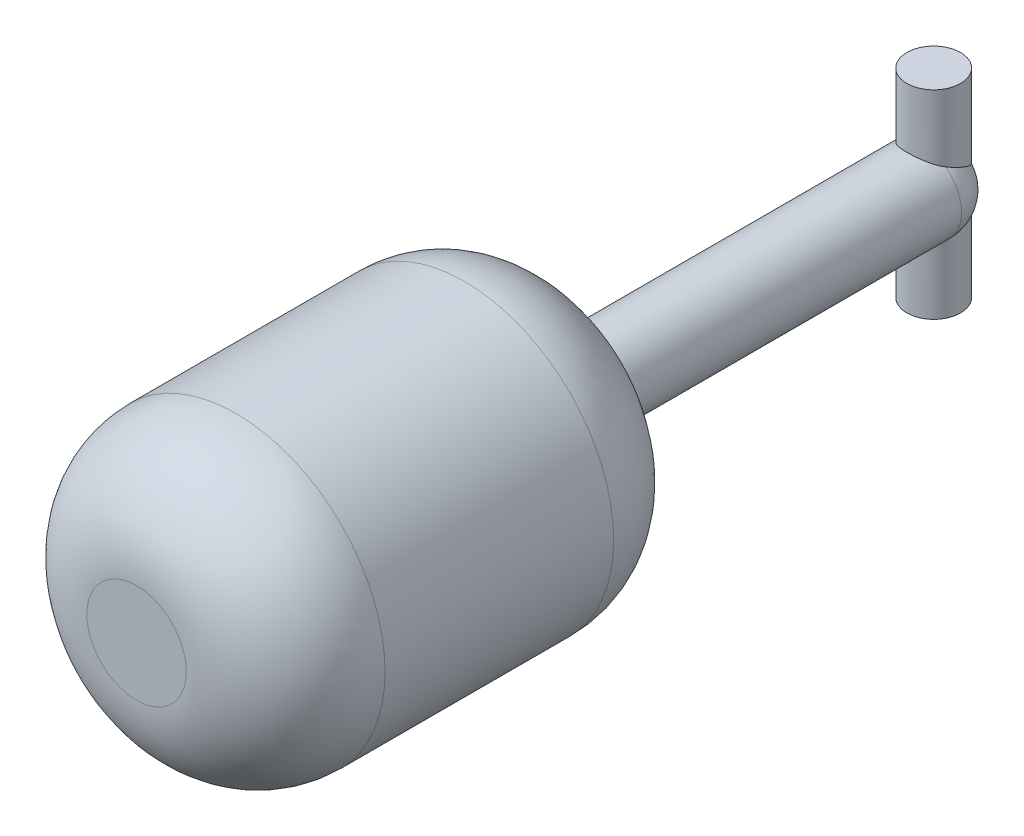
ISO-10303-21;
HEADER;
FILE_DESCRIPTION(('STEP AP214'),'2;1');
FILE_NAME('part.step','',(''),(''),'','','');
FILE_SCHEMA(('AUTOMOTIVE_DESIGN { 1 0 10303 214 1 1 1 1 }'));
ENDSEC;
DATA;
#1=APPLICATION_CONTEXT('core data for automotive mechanical design processes');
#2=APPLICATION_PROTOCOL_DEFINITION('international standard','automotive_design',2000,#1);
#3=PRODUCT_CONTEXT('',#1,'mechanical');
#4=PRODUCT('Part','Part','',(#3));
#5=PRODUCT_RELATED_PRODUCT_CATEGORY('part','',(#4));
#6=PRODUCT_DEFINITION_FORMATION('','',#4);
#7=PRODUCT_DEFINITION_CONTEXT('part definition',#1,'design');
#8=PRODUCT_DEFINITION('design','',#6,#7);
#9=PRODUCT_DEFINITION_SHAPE('','',#8);
#10=(LENGTH_UNIT() NAMED_UNIT(*) SI_UNIT(.MILLI.,.METRE.));
#11=(NAMED_UNIT(*) PLANE_ANGLE_UNIT() SI_UNIT($,.RADIAN.));
#12=(NAMED_UNIT(*) SI_UNIT($,.STERADIAN.) SOLID_ANGLE_UNIT());
#13=UNCERTAINTY_MEASURE_WITH_UNIT(LENGTH_MEASURE(1.E-05),#10,'distance_accuracy_value','');
#14=(GEOMETRIC_REPRESENTATION_CONTEXT(3) GLOBAL_UNCERTAINTY_ASSIGNED_CONTEXT((#13)) GLOBAL_UNIT_ASSIGNED_CONTEXT((#10,
#11,#12)) REPRESENTATION_CONTEXT('',''));
#15=CARTESIAN_POINT('',(0.,0.,0.));
#16=DIRECTION('',(0.,0.,1.));
#17=DIRECTION('',(1.,0.,0.));
#18=AXIS2_PLACEMENT_3D('',#15,#16,#17);
#19=CARTESIAN_POINT('',(0.,0.,83.));
#20=DIRECTION('',(0.,0.,1.));
#21=DIRECTION('',(1.,0.,0.));
#22=AXIS2_PLACEMENT_3D('',#19,#20,#21);
#23=PLANE('',#22);
#24=CARTESIAN_POINT('',(0.,0.,83.));
#25=DIRECTION('',(0.,0.,1.));
#26=DIRECTION('',(1.,0.,0.));
#27=AXIS2_PLACEMENT_3D('',#24,#25,#26);
#28=CIRCLE('',#27,5.);
#29=CARTESIAN_POINT('',(5.,0.,83.));
#30=VERTEX_POINT('',#29);
#31=EDGE_CURVE('E52',#30,#30,#28,.T.);
#32=ORIENTED_EDGE('',*,*,#31,.T.);
#33=EDGE_LOOP('',(#32));
#34=FACE_BOUND('',#33,.T.);
#35=ADVANCED_FACE('F44',(#34),#23,.T.);
#36=CARTESIAN_POINT('',(0.,0.,40.));
#37=DIRECTION('',(0.,0.,1.));
#38=DIRECTION('',(1.,0.,0.));
#39=AXIS2_PLACEMENT_3D('',#36,#37,#38);
#40=PLANE('',#39);
#41=CARTESIAN_POINT('',(0.,0.,40.));
#42=DIRECTION('',(0.,0.,1.));
#43=DIRECTION('',(1.,0.,0.));
#44=AXIS2_PLACEMENT_3D('',#41,#42,#43);
#45=CIRCLE('',#44,5.);
#46=CARTESIAN_POINT('',(5.,0.,40.));
#47=VERTEX_POINT('',#46);
#48=EDGE_CURVE('E71',#47,#47,#45,.F.);
#49=ORIENTED_EDGE('',*,*,#48,.T.);
#50=EDGE_LOOP('',(#49));
#51=FACE_BOUND('',#50,.T.);
#52=ADVANCED_FACE('F82',(#51),#40,.F.);
#53=CARTESIAN_POINT('',(0.,0.,50.));
#54=DIRECTION('',(0.,0.,1.));
#55=DIRECTION('',(1.,0.,0.));
#56=AXIS2_PLACEMENT_3D('',#53,#54,#55);
#57=DEGENERATE_TOROIDAL_SURFACE('',#56,5.,10.,.T.);
#58=ORIENTED_EDGE('',*,*,#48,.F.);
#59=EDGE_LOOP('',(#58));
#60=FACE_BOUND('',#59,.T.);
#61=CARTESIAN_POINT('',(0.,0.,50.));
#62=DIRECTION('',(0.,0.,1.));
#63=DIRECTION('',(1.,0.,0.));
#64=AXIS2_PLACEMENT_3D('',#61,#62,#63);
#65=CIRCLE('',#64,15.);
#66=CARTESIAN_POINT('',(15.,0.,50.));
#67=VERTEX_POINT('',#66);
#68=EDGE_CURVE('E74',#67,#67,#65,.T.);
#69=ORIENTED_EDGE('',*,*,#68,.F.);
#70=EDGE_LOOP('',(#69));
#71=FACE_BOUND('',#70,.T.);
#72=ADVANCED_FACE('F80',(#60,#71),#57,.T.);
#73=CARTESIAN_POINT('',(0.,0.,80.));
#74=DIRECTION('',(0.,0.,-1.));
#75=DIRECTION('',(-1.,0.,0.));
#76=AXIS2_PLACEMENT_3D('',#73,#74,#75);
#77=CYLINDRICAL_SURFACE('',#76,15.);
#78=CARTESIAN_POINT('',(0.,0.,73.));
#79=DIRECTION('',(0.,0.,1.));
#80=DIRECTION('',(1.,0.,0.));
#81=AXIS2_PLACEMENT_3D('',#78,#79,#80);
#82=CIRCLE('',#81,15.);
#83=CARTESIAN_POINT('',(15.,0.,73.));
#84=VERTEX_POINT('',#83);
#85=EDGE_CURVE('E11',#84,#84,#82,.F.);
#86=ORIENTED_EDGE('',*,*,#85,.T.);
#87=EDGE_LOOP('',(#86));
#88=FACE_BOUND('',#87,.T.);
#89=ORIENTED_EDGE('',*,*,#68,.T.);
#90=EDGE_LOOP('',(#89));
#91=FACE_BOUND('',#90,.T.);
#92=ADVANCED_FACE('F78',(#88,#91),#77,.T.);
#93=CARTESIAN_POINT('',(0.,0.,73.));
#94=DIRECTION('',(0.,0.,1.));
#95=DIRECTION('',(1.,0.,0.));
#96=AXIS2_PLACEMENT_3D('',#93,#94,#95);
#97=DEGENERATE_TOROIDAL_SURFACE('',#96,5.,10.,.T.);
#98=ORIENTED_EDGE('',*,*,#85,.F.);
#99=EDGE_LOOP('',(#98));
#100=FACE_BOUND('',#99,.T.);
#101=ORIENTED_EDGE('',*,*,#31,.F.);
#102=EDGE_LOOP('',(#101));
#103=FACE_BOUND('',#102,.T.);
#104=ADVANCED_FACE('F46',(#100,#103),#97,.T.);
#105=CLOSED_SHELL('',(#35,#52,#72,#92,#104));
#106=CARTESIAN_POINT('',(0.,0.,80.));
#107=DIRECTION('',(0.,0.,-1.));
#108=DIRECTION('',(-1.,0.,0.));
#109=AXIS2_PLACEMENT_3D('',#106,#107,#108);
#110=CYLINDRICAL_SURFACE('',#109,12.);
#111=CARTESIAN_POINT('',(0.,0.,70.));
#112=DIRECTION('',(0.,0.,1.));
#113=DIRECTION('',(1.,0.,0.));
#114=AXIS2_PLACEMENT_3D('',#111,#112,#113);
#115=CIRCLE('',#114,12.);
#116=CARTESIAN_POINT('',(12.,0.,70.));
#117=VERTEX_POINT('',#116);
#118=EDGE_CURVE('E60',#117,#117,#115,.T.);
#119=ORIENTED_EDGE('',*,*,#118,.T.);
#120=EDGE_LOOP('',(#119));
#121=FACE_BOUND('',#120,.T.);
#122=CARTESIAN_POINT('',(0.,0.,53.));
#123=DIRECTION('',(0.,0.,1.));
#124=DIRECTION('',(1.,0.,0.));
#125=AXIS2_PLACEMENT_3D('',#122,#123,#124);
#126=CIRCLE('',#125,12.);
#127=CARTESIAN_POINT('',(12.,0.,53.));
#128=VERTEX_POINT('',#127);
#129=EDGE_CURVE('E65',#128,#128,#126,.F.);
#130=ORIENTED_EDGE('',*,*,#129,.T.);
#131=EDGE_LOOP('',(#130));
#132=FACE_BOUND('',#131,.T.);
#133=ADVANCED_FACE('F109',(#121,#132),#110,.F.);
#134=CARTESIAN_POINT('',(0.,0.,43.));
#135=DIRECTION('',(0.,0.,1.));
#136=DIRECTION('',(1.,0.,0.));
#137=AXIS2_PLACEMENT_3D('',#134,#135,#136);
#138=PLANE('',#137);
#139=CARTESIAN_POINT('',(0.,0.,43.));
#140=DIRECTION('',(0.,0.,1.));
#141=DIRECTION('',(1.,0.,0.));
#142=AXIS2_PLACEMENT_3D('',#139,#140,#141);
#143=CIRCLE('',#142,2.);
#144=CARTESIAN_POINT('',(2.,0.,43.));
#145=VERTEX_POINT('',#144);
#146=EDGE_CURVE('E68',#145,#145,#143,.T.);
#147=ORIENTED_EDGE('',*,*,#146,.T.);
#148=EDGE_LOOP('',(#147));
#149=FACE_BOUND('',#148,.T.);
#150=ADVANCED_FACE('F107',(#149),#138,.T.);
#151=CARTESIAN_POINT('',(0.,0.,53.));
#152=DIRECTION('',(0.,0.,1.));
#153=DIRECTION('',(1.,0.,0.));
#154=AXIS2_PLACEMENT_3D('',#151,#152,#153);
#155=DEGENERATE_TOROIDAL_SURFACE('',#154,2.,10.,.T.);
#156=ORIENTED_EDGE('',*,*,#129,.F.);
#157=EDGE_LOOP('',(#156));
#158=FACE_BOUND('',#157,.T.);
#159=ORIENTED_EDGE('',*,*,#146,.F.);
#160=EDGE_LOOP('',(#159));
#161=FACE_BOUND('',#160,.T.);
#162=ADVANCED_FACE('F104',(#158,#161),#155,.F.);
#163=CARTESIAN_POINT('',(0.,0.,80.));
#164=DIRECTION('',(0.,0.,1.));
#165=DIRECTION('',(1.,0.,0.));
#166=AXIS2_PLACEMENT_3D('',#163,#164,#165);
#167=PLANE('',#166);
#168=CARTESIAN_POINT('',(0.,0.,80.));
#169=DIRECTION('',(0.,0.,1.));
#170=DIRECTION('',(1.,0.,0.));
#171=AXIS2_PLACEMENT_3D('',#168,#169,#170);
#172=CIRCLE('',#171,2.);
#173=CARTESIAN_POINT('',(2.,0.,80.));
#174=VERTEX_POINT('',#173);
#175=EDGE_CURVE('E56',#174,#174,#172,.F.);
#176=ORIENTED_EDGE('',*,*,#175,.T.);
#177=EDGE_LOOP('',(#176));
#178=FACE_BOUND('',#177,.T.);
#179=ADVANCED_FACE('F100',(#178),#167,.F.);
#180=CARTESIAN_POINT('',(0.,0.,70.));
#181=DIRECTION('',(0.,0.,1.));
#182=DIRECTION('',(1.,0.,0.));
#183=AXIS2_PLACEMENT_3D('',#180,#181,#182);
#184=DEGENERATE_TOROIDAL_SURFACE('',#183,2.,10.,.T.);
#185=ORIENTED_EDGE('',*,*,#175,.F.);
#186=EDGE_LOOP('',(#185));
#187=FACE_BOUND('',#186,.T.);
#188=ORIENTED_EDGE('',*,*,#118,.F.);
#189=EDGE_LOOP('',(#188));
#190=FACE_BOUND('',#189,.T.);
#191=ADVANCED_FACE('F103',(#187,#190),#184,.F.);
#192=CLOSED_SHELL('',(#133,#150,#162,#179,#191));
#193=ORIENTED_CLOSED_SHELL('',*,#192,.T.);
#194=BREP_WITH_VOIDS('B2',#105,(#193));
#195=CARTESIAN_POINT('',(0.,0.,40.));
#196=DIRECTION('',(0.,0.,-1.));
#197=DIRECTION('',(-1.,0.,0.));
#198=AXIS2_PLACEMENT_3D('',#195,#196,#197);
#199=CYLINDRICAL_SURFACE('',#198,4.);
#200=CARTESIAN_POINT('',(0.,-4.,5.5));
#201=CARTESIAN_POINT('',(0.13525164207156,-3.999993518137,5.49999290005186));
#202=CARTESIAN_POINT('',(0.270554028356534,-3.99307643232038,5.48977494154777));
#203=CARTESIAN_POINT('',(0.536851478418564,-3.9660753080996,5.44952242900665));
#204=CARTESIAN_POINT('',(0.667843000968334,-3.94598071504067,5.41947198982437));
#205=CARTESIAN_POINT('',(0.921237374068988,-3.89460751600821,5.34142171688508));
#206=CARTESIAN_POINT('',(1.04367877575305,-3.86338358991236,5.29350958802995));
#207=CARTESIAN_POINT('',(1.27825765475173,-3.79224252538454,5.18179668099204));
#208=CARTESIAN_POINT('',(1.39039412858649,-3.7523245416099,5.11799435768348));
#209=CARTESIAN_POINT('',(1.61205697896816,-3.66288843726566,4.970369372914));
#210=CARTESIAN_POINT('',(1.72053382128457,-3.61284047677658,4.88529862315981));
#211=CARTESIAN_POINT('',(1.92266533294142,-3.50945550197188,4.70056389289389));
#212=CARTESIAN_POINT('',(2.01629804570517,-3.45611377468099,4.60087870709038));
#213=CARTESIAN_POINT('',(2.2016374731949,-3.34162684993736,4.37099321756632));
#214=CARTESIAN_POINT('',(2.29056486800151,-3.28062033453726,4.23846616507814));
#215=CARTESIAN_POINT('',(2.44481502496016,-3.16733881888995,3.95694855652788));
#216=CARTESIAN_POINT('',(2.51017851323489,-3.11504883856034,3.80798699247689));
#217=CARTESIAN_POINT('',(2.5986388236772,-3.04127798290587,3.54196654773204));
#218=CARTESIAN_POINT('',(2.62851431747639,-3.01525894892984,3.42843373052885));
#219=CARTESIAN_POINT('',(2.67333867634867,-2.97559697930801,3.19643455089498));
#220=CARTESIAN_POINT('',(2.68831385195963,-2.96193223274288,3.07797727076724));
#221=CARTESIAN_POINT('',(2.70238874552766,-2.94910199602149,2.83876503424567));
#222=CARTESIAN_POINT('',(2.70141713183757,-2.95000165371578,2.71800216877523));
#223=CARTESIAN_POINT('',(2.68349689692319,-2.96630639076805,2.47863579362976));
#224=CARTESIAN_POINT('',(2.66653663287508,-2.98172204056105,2.36003392173356));
#225=CARTESIAN_POINT('',(2.6190035634682,-3.02353152860114,2.13402935766074));
#226=CARTESIAN_POINT('',(2.58914308881994,-3.04934666584866,2.02636280693319));
#227=CARTESIAN_POINT('',(2.5173142214509,-3.10890744847768,1.81747838350058));
#228=CARTESIAN_POINT('',(2.47533650857834,-3.14265919469987,1.71626554820684));
#229=CARTESIAN_POINT('',(2.35761593635998,-3.23255557456621,1.47431907083862));
#230=CARTESIAN_POINT('',(2.27532898573239,-3.29168544424409,1.3378595463383));
#231=CARTESIAN_POINT('',(2.08897003320918,-3.4130065102,1.08206274665898));
#232=CARTESIAN_POINT('',(1.98485850538836,-3.47520310205832,0.962757208751298));
#233=CARTESIAN_POINT('',(1.755422941596,-3.59659270451757,0.742336374084662));
#234=CARTESIAN_POINT('',(1.62993584933008,-3.65575770192453,0.641374254723838));
#235=CARTESIAN_POINT('',(1.36018379757103,-3.76442995528449,0.462050947950952));
#236=CARTESIAN_POINT('',(1.21595837203485,-3.81395701073601,0.383643264308921));
#237=CARTESIAN_POINT('',(0.945613760177467,-3.88856250325703,0.267726689034686));
#238=CARTESIAN_POINT('',(0.822549258937164,-3.91662580532116,0.225007032745261));
#239=CARTESIAN_POINT('',(0.569590487871059,-3.96131472415193,0.157527397342875));
#240=CARTESIAN_POINT('',(0.439700861576448,-3.97794801168562,0.132755372834098));
#241=CARTESIAN_POINT('',(0.176241405854664,-3.99830519761612,0.102487850774166));
#242=CARTESIAN_POINT('',(0.0426611239974739,-4.00198758891438,0.0970543316853545));
#243=CARTESIAN_POINT('',(-0.223536078802516,-3.99596741539106,0.105975754487917));
#244=CARTESIAN_POINT('',(-0.356152931631484,-3.98626391327706,0.120332082082308));
#245=CARTESIAN_POINT('',(-0.609770387964585,-3.95521155503772,0.166755901176293));
#246=CARTESIAN_POINT('',(-0.731019794201065,-3.9344727327074,0.19789662061766));
#247=CARTESIAN_POINT('',(-0.966225980547811,-3.88341424434936,0.275763868066081));
#248=CARTESIAN_POINT('',(-1.08018142454689,-3.85309282898366,0.32249324192658));
#249=CARTESIAN_POINT('',(-1.30794946620335,-3.7821492272186,0.434270876578236));
#250=CARTESIAN_POINT('',(-1.42096995748598,-3.74088228847242,0.500515025583156));
#251=CARTESIAN_POINT('',(-1.63481662527914,-3.65250451318952,0.647275590459889));
#252=CARTESIAN_POINT('',(-1.73563298865063,-3.60538903478359,0.727803364983003));
#253=CARTESIAN_POINT('',(-1.93982421981794,-3.50033540739044,0.916002443897186));
#254=CARTESIAN_POINT('',(-2.0408387055737,-3.44190010190649,1.02596063913661));
#255=CARTESIAN_POINT('',(-2.22383735602996,-3.32659589692022,1.26155719577649));
#256=CARTESIAN_POINT('',(-2.30581499668977,-3.26972754028787,1.38720091008296));
#257=CARTESIAN_POINT('',(-2.43828787268088,-3.17182959670112,1.63326598576168));
#258=CARTESIAN_POINT('',(-2.49164892498811,-3.12970180559621,1.75169899393767));
#259=CARTESIAN_POINT('',(-2.5814132242981,-3.0560916236245,1.99788464976802));
#260=CARTESIAN_POINT('',(-2.61784967930158,-3.02458841967376,2.12561847330661));
#261=CARTESIAN_POINT('',(-2.66752870963451,-2.98080925657186,2.36748916813316));
#262=CARTESIAN_POINT('',(-2.68349685770396,-2.96630524240168,2.4806518023036));
#263=CARTESIAN_POINT('',(-2.70088750358726,-2.9504848522829,2.70897630649806));
#264=CARTESIAN_POINT('',(-2.70232146140912,-2.94915808627297,2.82413652966416));
#265=CARTESIAN_POINT('',(-2.69056589995094,-2.95988294671172,3.05293007016665));
#266=CARTESIAN_POINT('',(-2.67739041434289,-2.97192173436909,3.1665647468844));
#267=CARTESIAN_POINT('',(-2.6372906054618,-3.00755697238461,3.38955541031351));
#268=CARTESIAN_POINT('',(-2.61034731289303,-3.03116936703232,3.49890526899653));
#269=CARTESIAN_POINT('',(-2.53309831794016,-3.09624097293121,3.74617838300419));
#270=CARTESIAN_POINT('',(-2.47803114343028,-3.14101248946805,3.88173007004604));
#271=CARTESIAN_POINT('',(-2.34852878478864,-3.23898118039819,4.13990562652224));
#272=CARTESIAN_POINT('',(-2.27406462296232,-3.29219091395031,4.26250976480838));
#273=CARTESIAN_POINT('',(-2.10591179352206,-3.40227029378641,4.49594141985187));
#274=CARTESIAN_POINT('',(-2.01188235686719,-3.45919050700335,4.60649852561071));
#275=CARTESIAN_POINT('',(-1.80654699356942,-3.57071683838806,4.81182535802022));
#276=CARTESIAN_POINT('',(-1.69523660906829,-3.62532235480782,4.90659099792986));
#277=CARTESIAN_POINT('',(-1.5096483541119,-3.70488819543881,5.04001039631132));
#278=CARTESIAN_POINT('',(-1.44082200773415,-3.73226129612847,5.08491845787222));
#279=CARTESIAN_POINT('',(-1.29855562801917,-3.78410818508872,5.16866190293594));
#280=CARTESIAN_POINT('',(-1.22511798891828,-3.80858345920418,5.20750040187114));
#281=CARTESIAN_POINT('',(-1.07415945769402,-3.85387849802484,5.27853308650619));
#282=CARTESIAN_POINT('',(-0.996645205253495,-3.87470398132586,5.31073768053859));
#283=CARTESIAN_POINT('',(-0.838076916347868,-3.91206651309577,5.36802149212262));
#284=CARTESIAN_POINT('',(-0.757024673840152,-3.92860570610492,5.39310427350142));
#285=CARTESIAN_POINT('',(-0.565494865818998,-3.96136585143772,5.44251238741761));
#286=CARTESIAN_POINT('',(-0.45394534906109,-3.97576987460958,5.46399374577891));
#287=CARTESIAN_POINT('',(-0.228275312759472,-3.99508798122612,5.49273799664422));
#288=CARTESIAN_POINT('',(-0.114155730903964,-4.00000547085267,5.50000599253183));
#289=CARTESIAN_POINT('',(0.,-4.,5.5));
#290=B_SPLINE_CURVE_WITH_KNOTS('',3,(#200,#201,#202,#203,#204,#205,#206,#207,#208,#209,#210,
#211,#212,#213,#214,#215,#216,#217,#218,#219,#220,#221,#222,#223,#224,#225,#226,#227,#228,#229,
#230,#231,#232,#233,#234,#235,#236,#237,#238,#239,#240,#241,#242,#243,#244,#245,#246,#247,#248,
#249,#250,#251,#252,#253,#254,#255,#256,#257,#258,#259,#260,#261,#262,#263,#264,#265,#266,#267,
#268,#269,#270,#271,#272,#273,#274,#275,#276,#277,#278,#279,#280,#281,#282,#283,#284,#285,#286,
#287,#288,#289),.UNSPECIFIED.,.T.,.F.,(4,2,2,2,2,2,2,2,2,2,2,2,2,2,2,2,2,2,2,2,2,2,2,2,2,2,2,2,
2,2,2,2,2,2,2,2,2,2,2,2,2,2,2,2,4),(0.,0.405302928326555,0.810930885199098,1.21459280341186,
1.61829398811156,2.05663420368272,2.49561685627629,3.00585079402765,3.51519860469972,
3.87452588033693,4.23321753456295,4.59351408943453,4.95407321257599,5.2968565192074,
5.63990418842015,6.14716538760557,6.65535333658142,7.16760729266616,7.67879753658696,
8.07687988795747,8.47469482173064,8.87378358021571,9.27290028467719,9.65195021770373,
10.0310693877148,10.4415600468648,10.8523786127248,11.3314859942209,11.8107573271643,
12.2189593065689,12.626356927887,12.9704053510091,13.3141824755843,13.6576296574618,
14.0015513222027,14.4581145208588,14.9153637431591,15.3813672616271,15.8474911924722,
16.107028588755,16.3664323269852,16.6254259179722,16.8842896766038,17.2264982663144,
17.5685839616301),.UNSPECIFIED.);
#291=CARTESIAN_POINT('',(-2.41867732448957,-3.18590646441479,4.));
#292=VERTEX_POINT('',#291);
#293=CARTESIAN_POINT('',(2.41867732448957,-3.18590646441479,4.));
#294=VERTEX_POINT('',#293);
#295=EDGE_CURVE('E226',#292,#294,#290,.T.);
#296=ORIENTED_EDGE('',*,*,#295,.T.);
#297=CARTESIAN_POINT('',(0.,0.,4.));
#298=DIRECTION('',(0.,0.,-1.));
#299=DIRECTION('',(-1.,0.,0.));
#300=AXIS2_PLACEMENT_3D('',#297,#298,#299);
#301=CIRCLE('',#300,4.);
#302=CARTESIAN_POINT('',(2.41867732448957,3.18590646441479,4.));
#303=VERTEX_POINT('',#302);
#304=EDGE_CURVE('E229',#294,#303,#301,.F.);
#305=ORIENTED_EDGE('',*,*,#304,.T.);
#306=CARTESIAN_POINT('',(0.,4.,5.5));
#307=CARTESIAN_POINT('',(-0.13525164207156,3.999993518137,5.49999290005186));
#308=CARTESIAN_POINT('',(-0.270554028356534,3.99307643232038,5.48977494154777));
#309=CARTESIAN_POINT('',(-0.536851478418564,3.9660753080996,5.44952242900665));
#310=CARTESIAN_POINT('',(-0.667843000968334,3.94598071504067,5.41947198982437));
#311=CARTESIAN_POINT('',(-0.921237374068988,3.89460751600821,5.34142171688508));
#312=CARTESIAN_POINT('',(-1.04367877575305,3.86338358991236,5.29350958802995));
#313=CARTESIAN_POINT('',(-1.27825765475173,3.79224252538454,5.18179668099204));
#314=CARTESIAN_POINT('',(-1.39039412858649,3.7523245416099,5.11799435768348));
#315=CARTESIAN_POINT('',(-1.61205697896816,3.66288843726566,4.970369372914));
#316=CARTESIAN_POINT('',(-1.72053382128457,3.61284047677658,4.88529862315981));
#317=CARTESIAN_POINT('',(-1.92266533294142,3.50945550197188,4.70056389289389));
#318=CARTESIAN_POINT('',(-2.01629804570517,3.45611377468099,4.60087870709038));
#319=CARTESIAN_POINT('',(-2.2016374731949,3.34162684993736,4.37099321756632));
#320=CARTESIAN_POINT('',(-2.29056486800151,3.28062033453726,4.23846616507814));
#321=CARTESIAN_POINT('',(-2.44481502496016,3.16733881888995,3.95694855652788));
#322=CARTESIAN_POINT('',(-2.51017851323489,3.11504883856034,3.80798699247689));
#323=CARTESIAN_POINT('',(-2.5986388236772,3.04127798290587,3.54196654773204));
#324=CARTESIAN_POINT('',(-2.62851431747639,3.01525894892984,3.42843373052885));
#325=CARTESIAN_POINT('',(-2.67333867634867,2.97559697930801,3.19643455089498));
#326=CARTESIAN_POINT('',(-2.68831385195963,2.96193223274288,3.07797727076724));
#327=CARTESIAN_POINT('',(-2.70238874552766,2.94910199602149,2.83876503424567));
#328=CARTESIAN_POINT('',(-2.70141713183757,2.95000165371578,2.71800216877523));
#329=CARTESIAN_POINT('',(-2.68349689692319,2.96630639076805,2.47863579362976));
#330=CARTESIAN_POINT('',(-2.66653663287508,2.98172204056105,2.36003392173356));
#331=CARTESIAN_POINT('',(-2.6190035634682,3.02353152860114,2.13402935766074));
#332=CARTESIAN_POINT('',(-2.58914308881994,3.04934666584866,2.02636280693319));
#333=CARTESIAN_POINT('',(-2.5173142214509,3.10890744847768,1.81747838350058));
#334=CARTESIAN_POINT('',(-2.47533650857834,3.14265919469987,1.71626554820684));
#335=CARTESIAN_POINT('',(-2.35761593635998,3.23255557456621,1.47431907083862));
#336=CARTESIAN_POINT('',(-2.27532898573239,3.29168544424409,1.3378595463383));
#337=CARTESIAN_POINT('',(-2.08897003320918,3.4130065102,1.08206274665898));
#338=CARTESIAN_POINT('',(-1.98485850538836,3.47520310205832,0.962757208751298));
#339=CARTESIAN_POINT('',(-1.755422941596,3.59659270451757,0.742336374084662));
#340=CARTESIAN_POINT('',(-1.62993584933008,3.65575770192453,0.641374254723838));
#341=CARTESIAN_POINT('',(-1.36018379757103,3.76442995528449,0.462050947950952));
#342=CARTESIAN_POINT('',(-1.21595837203485,3.81395701073601,0.383643264308921));
#343=CARTESIAN_POINT('',(-0.945613760177467,3.88856250325703,0.267726689034686));
#344=CARTESIAN_POINT('',(-0.822549258937164,3.91662580532116,0.225007032745261));
#345=CARTESIAN_POINT('',(-0.569590487871059,3.96131472415193,0.157527397342875));
#346=CARTESIAN_POINT('',(-0.439700861576448,3.97794801168562,0.132755372834098));
#347=CARTESIAN_POINT('',(-0.176241405854664,3.99830519761612,0.102487850774166));
#348=CARTESIAN_POINT('',(-0.0426611239974739,4.00198758891438,0.0970543316853545));
#349=CARTESIAN_POINT('',(0.223536078802516,3.99596741539106,0.105975754487917));
#350=CARTESIAN_POINT('',(0.356152931631484,3.98626391327706,0.120332082082308));
#351=CARTESIAN_POINT('',(0.609770387964585,3.95521155503772,0.166755901176293));
#352=CARTESIAN_POINT('',(0.731019794201065,3.9344727327074,0.19789662061766));
#353=CARTESIAN_POINT('',(0.966225980547811,3.88341424434936,0.275763868066081));
#354=CARTESIAN_POINT('',(1.08018142454689,3.85309282898366,0.32249324192658));
#355=CARTESIAN_POINT('',(1.30794946620335,3.7821492272186,0.434270876578236));
#356=CARTESIAN_POINT('',(1.42096995748598,3.74088228847242,0.500515025583156));
#357=CARTESIAN_POINT('',(1.63481662527914,3.65250451318952,0.647275590459889));
#358=CARTESIAN_POINT('',(1.73563298865063,3.60538903478359,0.727803364983003));
#359=CARTESIAN_POINT('',(1.93982421981794,3.50033540739044,0.916002443897186));
#360=CARTESIAN_POINT('',(2.0408387055737,3.44190010190649,1.02596063913661));
#361=CARTESIAN_POINT('',(2.22383735602996,3.32659589692022,1.26155719577649));
#362=CARTESIAN_POINT('',(2.30581499668977,3.26972754028787,1.38720091008296));
#363=CARTESIAN_POINT('',(2.43828787268088,3.17182959670112,1.63326598576168));
#364=CARTESIAN_POINT('',(2.49164892498811,3.12970180559621,1.75169899393767));
#365=CARTESIAN_POINT('',(2.5814132242981,3.0560916236245,1.99788464976802));
#366=CARTESIAN_POINT('',(2.61784967930158,3.02458841967376,2.12561847330661));
#367=CARTESIAN_POINT('',(2.66752870963451,2.98080925657186,2.36748916813316));
#368=CARTESIAN_POINT('',(2.68349685770396,2.96630524240168,2.4806518023036));
#369=CARTESIAN_POINT('',(2.70088750358726,2.9504848522829,2.70897630649806));
#370=CARTESIAN_POINT('',(2.70232146140912,2.94915808627297,2.82413652966416));
#371=CARTESIAN_POINT('',(2.69056589995094,2.95988294671172,3.05293007016665));
#372=CARTESIAN_POINT('',(2.67739041434289,2.97192173436909,3.1665647468844));
#373=CARTESIAN_POINT('',(2.6372906054618,3.00755697238461,3.38955541031351));
#374=CARTESIAN_POINT('',(2.61034731289303,3.03116936703232,3.49890526899653));
#375=CARTESIAN_POINT('',(2.53309831794016,3.09624097293121,3.74617838300419));
#376=CARTESIAN_POINT('',(2.47803114343028,3.14101248946805,3.88173007004604));
#377=CARTESIAN_POINT('',(2.34852878478864,3.23898118039819,4.13990562652224));
#378=CARTESIAN_POINT('',(2.27406462296232,3.29219091395031,4.26250976480838));
#379=CARTESIAN_POINT('',(2.10591179352206,3.40227029378641,4.49594141985187));
#380=CARTESIAN_POINT('',(2.01188235686719,3.45919050700335,4.60649852561071));
#381=CARTESIAN_POINT('',(1.80654699356942,3.57071683838806,4.81182535802022));
#382=CARTESIAN_POINT('',(1.69523660906829,3.62532235480782,4.90659099792986));
#383=CARTESIAN_POINT('',(1.5096483541119,3.70488819543881,5.04001039631132));
#384=CARTESIAN_POINT('',(1.44082200773415,3.73226129612847,5.08491845787222));
#385=CARTESIAN_POINT('',(1.29855562801917,3.78410818508872,5.16866190293594));
#386=CARTESIAN_POINT('',(1.22511798891828,3.80858345920418,5.20750040187114));
#387=CARTESIAN_POINT('',(1.07415945769402,3.85387849802484,5.27853308650619));
#388=CARTESIAN_POINT('',(0.996645205253495,3.87470398132586,5.31073768053859));
#389=CARTESIAN_POINT('',(0.838076916347868,3.91206651309577,5.36802149212262));
#390=CARTESIAN_POINT('',(0.757024673840152,3.92860570610492,5.39310427350142));
#391=CARTESIAN_POINT('',(0.565494865818998,3.96136585143772,5.44251238741761));
#392=CARTESIAN_POINT('',(0.45394534906109,3.97576987460958,5.46399374577891));
#393=CARTESIAN_POINT('',(0.228275312759472,3.99508798122612,5.49273799664422));
#394=CARTESIAN_POINT('',(0.114155730903964,4.00000547085267,5.50000599253183));
#395=CARTESIAN_POINT('',(0.,4.,5.5));
#396=B_SPLINE_CURVE_WITH_KNOTS('',3,(#306,#307,#308,#309,#310,#311,#312,#313,#314,#315,#316,
#317,#318,#319,#320,#321,#322,#323,#324,#325,#326,#327,#328,#329,#330,#331,#332,#333,#334,#335,
#336,#337,#338,#339,#340,#341,#342,#343,#344,#345,#346,#347,#348,#349,#350,#351,#352,#353,#354,
#355,#356,#357,#358,#359,#360,#361,#362,#363,#364,#365,#366,#367,#368,#369,#370,#371,#372,#373,
#374,#375,#376,#377,#378,#379,#380,#381,#382,#383,#384,#385,#386,#387,#388,#389,#390,#391,#392,
#393,#394,#395),.UNSPECIFIED.,.T.,.F.,(4,2,2,2,2,2,2,2,2,2,2,2,2,2,2,2,2,2,2,2,2,2,2,2,2,2,2,2,
2,2,2,2,2,2,2,2,2,2,2,2,2,2,2,2,4),(0.,0.405302928326555,0.810930885199098,1.21459280341186,
1.61829398811156,2.05663420368272,2.49561685627629,3.00585079402765,3.51519860469972,
3.87452588033693,4.23321753456295,4.59351408943453,4.95407321257599,5.2968565192074,
5.63990418842015,6.14716538760557,6.65535333658142,7.16760729266616,7.67879753658696,
8.07687988795747,8.47469482173064,8.87378358021571,9.27290028467719,9.65195021770373,
10.0310693877148,10.4415600468648,10.8523786127248,11.3314859942209,11.8107573271643,
12.2189593065689,12.626356927887,12.9704053510091,13.3141824755843,13.6576296574618,
14.0015513222027,14.4581145208588,14.9153637431591,15.3813672616271,15.8474911924722,
16.107028588755,16.3664323269852,16.6254259179722,16.8842896766038,17.2264982663144,
17.5685839616301),.UNSPECIFIED.);
#397=CARTESIAN_POINT('',(-2.41867732448957,3.18590646441479,4.));
#398=VERTEX_POINT('',#397);
#399=EDGE_CURVE('E232',#303,#398,#396,.T.);
#400=ORIENTED_EDGE('',*,*,#399,.T.);
#401=CARTESIAN_POINT('',(0.,0.,4.));
#402=DIRECTION('',(0.,0.,-1.));
#403=DIRECTION('',(-1.,0.,0.));
#404=AXIS2_PLACEMENT_3D('',#401,#402,#403);
#405=CIRCLE('',#404,4.);
#406=EDGE_CURVE('E230',#398,#292,#405,.F.);
#407=ORIENTED_EDGE('',*,*,#406,.T.);
#408=EDGE_LOOP('',(#296,#305,#400,#407));
#409=FACE_BOUND('',#408,.T.);
#410=CARTESIAN_POINT('',(0.,0.,40.));
#411=DIRECTION('',(0.,0.,1.));
#412=DIRECTION('',(1.,0.,0.));
#413=AXIS2_PLACEMENT_3D('',#410,#411,#412);
#414=CIRCLE('',#413,4.);
#415=CARTESIAN_POINT('',(4.,0.,40.));
#416=VERTEX_POINT('',#415);
#417=EDGE_CURVE('E231',#416,#416,#414,.T.);
#418=ORIENTED_EDGE('',*,*,#417,.F.);
#419=EDGE_LOOP('',(#418));
#420=FACE_BOUND('',#419,.T.);
#421=ADVANCED_FACE('F192',(#409,#420),#199,.T.);
#422=CARTESIAN_POINT('',(0.,0.,40.));
#423=DIRECTION('',(0.,0.,1.));
#424=DIRECTION('',(1.,0.,0.));
#425=AXIS2_PLACEMENT_3D('',#422,#423,#424);
#426=PLANE('',#425);
#427=ORIENTED_EDGE('',*,*,#417,.T.);
#428=EDGE_LOOP('',(#427));
#429=FACE_BOUND('',#428,.T.);
#430=ADVANCED_FACE('F247',(#429),#426,.T.);
#431=CARTESIAN_POINT('',(0.,10.,2.8));
#432=DIRECTION('',(0.,1.,0.));
#433=DIRECTION('',(0.,0.,1.));
#434=AXIS2_PLACEMENT_3D('',#431,#432,#433);
#435=PLANE('',#434);
#436=CARTESIAN_POINT('',(0.,10.,2.8));
#437=DIRECTION('',(0.,1.,0.));
#438=DIRECTION('',(0.,0.,1.));
#439=AXIS2_PLACEMENT_3D('',#436,#437,#438);
#440=CIRCLE('',#439,2.7);
#441=CARTESIAN_POINT('',(0.,10.,5.5));
#442=VERTEX_POINT('',#441);
#443=EDGE_CURVE('E275',#442,#442,#440,.T.);
#444=ORIENTED_EDGE('',*,*,#443,.T.);
#445=EDGE_LOOP('',(#444));
#446=FACE_BOUND('',#445,.T.);
#447=ADVANCED_FACE('F263',(#446),#435,.T.);
#448=CARTESIAN_POINT('',(0.,-10.,2.8));
#449=DIRECTION('',(0.,1.,0.));
#450=DIRECTION('',(0.,0.,1.));
#451=AXIS2_PLACEMENT_3D('',#448,#449,#450);
#452=CYLINDRICAL_SURFACE('',#451,2.7);
#453=ORIENTED_EDGE('',*,*,#443,.F.);
#454=EDGE_LOOP('',(#453));
#455=FACE_BOUND('',#454,.T.);
#456=ORIENTED_EDGE('',*,*,#399,.F.);
#457=CARTESIAN_POINT('',(2.41867732448957,3.18590646441479,4.));
#458=CARTESIAN_POINT('',(2.45492909212996,3.15839294052424,3.92695156175378));
#459=CARTESIAN_POINT('',(2.48771758414108,3.13000536775839,3.85253309888428));
#460=CARTESIAN_POINT('',(2.5462875463546,3.07160980134171,3.7016399633198));
#461=CARTESIAN_POINT('',(2.57207178506884,3.04160245356395,3.62516611621246));
#462=CARTESIAN_POINT('',(2.61651394704204,2.98016653939499,3.47102175748681));
#463=CARTESIAN_POINT('',(2.63519328844404,2.94874256908289,3.39335558866503));
#464=CARTESIAN_POINT('',(2.66554795634037,2.88451498860138,3.23724727235668));
#465=CARTESIAN_POINT('',(2.67722272116352,2.85171126802051,3.15880506315479));
#466=CARTESIAN_POINT('',(2.70177380998873,2.75148238785563,2.92342003797798));
#467=CARTESIAN_POINT('',(2.70426727363915,2.6821133879833,2.76609970409627));
#468=CARTESIAN_POINT('',(2.68244284826093,2.53924826569995,2.45527894351561));
#469=CARTESIAN_POINT('',(2.65810837399867,2.46574961698045,2.30178093982924));
#470=CARTESIAN_POINT('',(2.58216098097444,2.31151274042805,1.99451491081082));
#471=CARTESIAN_POINT('',(2.52914377106274,2.2305979607114,1.84118137087347));
#472=CARTESIAN_POINT('',(2.39726440990542,2.0664998267294,1.54737058527256));
#473=CARTESIAN_POINT('',(2.31839376328675,1.98331573502218,1.40689758498602));
#474=CARTESIAN_POINT('',(2.13261632615452,1.81191866756235,1.13555791019331));
#475=CARTESIAN_POINT('',(2.02447252286077,1.72366774581649,1.00556135860578));
#476=CARTESIAN_POINT('',(1.78511587142592,1.54890090973742,0.76729397698571));
#477=CARTESIAN_POINT('',(1.6539000086965,1.4623852237773,0.659025989964243));
#478=CARTESIAN_POINT('',(1.39976170276442,1.31286762226292,0.487171743732231));
#479=CARTESIAN_POINT('',(1.28063272628901,1.24867576923873,0.418975848123359));
#480=CARTESIAN_POINT('',(1.02981939899475,1.12879255800613,0.30026488008519));
#481=CARTESIAN_POINT('',(0.898153047463096,1.07308930340874,0.249724932739596));
#482=CARTESIAN_POINT('',(0.667524305264878,0.993936363768721,0.182023631836955));
#483=CARTESIAN_POINT('',(0.57178712814632,0.965883989804166,0.159353101504468));
#484=CARTESIAN_POINT('',(0.375925348745497,0.921522601580037,0.124460168068231));
#485=CARTESIAN_POINT('',(0.275815606333563,0.9051766666665,0.112204893509687));
#486=CARTESIAN_POINT('',(0.0725518660396856,0.887584973184236,0.0990438323241003));
#487=CARTESIAN_POINT('',(-0.0306209302243938,0.886470540154486,0.0982367494038773));
#488=CARTESIAN_POINT('',(-0.23542707524653,0.900000129668876,0.108321065602294));
#489=CARTESIAN_POINT('',(-0.337057322419872,0.914672490514486,0.119233501939875));
#490=CARTESIAN_POINT('',(-0.557557621597338,0.960951039300074,0.155340678482994));
#491=CARTESIAN_POINT('',(-0.675336051467602,0.995559276477206,0.183137377932168));
#492=CARTESIAN_POINT('',(-0.902736968851264,1.07603514545895,0.252592497250785));
#493=CARTESIAN_POINT('',(-1.01233430376913,1.12193577572373,0.294291671899607));
#494=CARTESIAN_POINT('',(-1.26693117410658,1.24054788446717,0.4100701335453));
#495=CARTESIAN_POINT('',(-1.40760560239681,1.31645170962752,0.490399602612019));
#496=CARTESIAN_POINT('',(-1.67050470163609,1.47341152921666,0.672795583504339));
#497=CARTESIAN_POINT('',(-1.79272961296782,1.55446745649806,0.774861812075296));
#498=CARTESIAN_POINT('',(-2.01874952012817,1.71948159612512,0.999875836648061));
#499=CARTESIAN_POINT('',(-2.12222446149328,1.803465404078,1.12312677331003));
#500=CARTESIAN_POINT('',(-2.30587765238738,1.97079475944158,1.38625651334898));
#501=CARTESIAN_POINT('',(-2.38605766094524,2.05414035458152,1.52613406010576));
#502=CARTESIAN_POINT('',(-2.52499774093041,2.22397859091486,1.8285063489687));
#503=CARTESIAN_POINT('',(-2.58203991275474,2.31032682045036,1.99187836865072));
#504=CARTESIAN_POINT('',(-2.66416596942132,2.47903828385743,2.32854206432496));
#505=CARTESIAN_POINT('',(-2.68923468396406,2.56139960826488,2.5018384083517));
#506=CARTESIAN_POINT('',(-2.70492604193906,2.71824004175909,2.84703410196459));
#507=CARTESIAN_POINT('',(-2.69661758306547,2.79288642663051,3.01880296463763));
#508=CARTESIAN_POINT('',(-2.65938379374455,2.89999943414184,3.27446502683597));
#509=CARTESIAN_POINT('',(-2.64285848201908,2.93487808579929,3.35931184263066));
#510=CARTESIAN_POINT('',(-2.60154059608987,3.00291872124254,3.52765293169978));
#511=CARTESIAN_POINT('',(-2.57675311940872,3.03608174898181,3.61114800573671));
#512=CARTESIAN_POINT('',(-2.52958039101994,3.08869003319146,3.74566243106618));
#513=CARTESIAN_POINT('',(-2.50965959138154,3.10869798878369,3.79734087147989));
#514=CARTESIAN_POINT('',(-2.46658618862746,3.14790705473736,3.89955634659741));
#515=CARTESIAN_POINT('',(-2.44343784324495,3.16710918540636,3.95009478475804));
#516=CARTESIAN_POINT('',(-2.41867732448957,3.1859064644148,4.));
#517=B_SPLINE_CURVE_WITH_KNOTS('',3,(#457,#458,#459,#460,#461,#462,#463,#464,#465,#466,#467,
#468,#469,#470,#471,#472,#473,#474,#475,#476,#477,#478,#479,#480,#481,#482,#483,#484,#485,#486,
#487,#488,#489,#490,#491,#492,#493,#494,#495,#496,#497,#498,#499,#500,#501,#502,#503,#504,#505,
#506,#507,#508,#509,#510,#511,#512,#513,#514,#515,#516),.UNSPECIFIED.,.F.,.F.,(4,2,2,2,2,2,2,2,
2,2,2,2,2,2,2,2,2,2,2,2,2,2,2,2,2,2,2,2,2,4),(0.,0.258086941827533,0.516071722891899,
0.773272510369537,1.03049391907481,1.54388522125663,2.05759408387638,2.59908937845855,
3.14076278567602,3.71039594963616,4.28010359707555,4.7332810371246,5.1858174100304,
5.49173638504153,5.79668622909823,6.10426369887705,6.41239421237403,6.78792446473917,
7.16456539919243,7.69846751789103,8.23236267966483,8.77465384144308,9.31690404350351,
9.89417623131892,10.4717222130534,11.030922218849,11.310242554597,11.5893908755865,
11.7659598468978,11.9422980567398),.UNSPECIFIED.);
#518=EDGE_CURVE('E205',#303,#398,#517,.T.);
#519=ORIENTED_EDGE('',*,*,#518,.T.);
#520=EDGE_LOOP('',(#456,#519));
#521=FACE_BOUND('',#520,.T.);
#522=ADVANCED_FACE('F244',(#455,#521),#452,.T.);
#523=CARTESIAN_POINT('',(0.,-10.,2.8));
#524=DIRECTION('',(0.,1.,0.));
#525=DIRECTION('',(0.,0.,1.));
#526=AXIS2_PLACEMENT_3D('',#523,#524,#525);
#527=CIRCLE('',#526,2.7);
#528=CARTESIAN_POINT('',(0.,-10.,5.5));
#529=VERTEX_POINT('',#528);
#530=EDGE_CURVE('E272',#529,#529,#527,.T.);
#531=ORIENTED_EDGE('',*,*,#530,.T.);
#532=EDGE_LOOP('',(#531));
#533=FACE_BOUND('',#532,.T.);
#534=ORIENTED_EDGE('',*,*,#295,.F.);
#535=CARTESIAN_POINT('',(-2.41867732448957,-3.18590646441479,4.));
#536=CARTESIAN_POINT('',(-2.45492909212996,-3.15839294052424,3.92695156175378));
#537=CARTESIAN_POINT('',(-2.48771758414108,-3.13000536775839,3.85253309888428));
#538=CARTESIAN_POINT('',(-2.5462875463546,-3.07160980134171,3.7016399633198));
#539=CARTESIAN_POINT('',(-2.57207178506884,-3.04160245356395,3.62516611621246));
#540=CARTESIAN_POINT('',(-2.61651394704204,-2.98016653939499,3.47102175748681));
#541=CARTESIAN_POINT('',(-2.63519328844404,-2.94874256908289,3.39335558866503));
#542=CARTESIAN_POINT('',(-2.66554795634037,-2.88451498860138,3.23724727235668));
#543=CARTESIAN_POINT('',(-2.67722272116352,-2.85171126802051,3.15880506315479));
#544=CARTESIAN_POINT('',(-2.70177380998873,-2.75148238785563,2.92342003797798));
#545=CARTESIAN_POINT('',(-2.70426727363915,-2.6821133879833,2.76609970409627));
#546=CARTESIAN_POINT('',(-2.68244284826093,-2.53924826569995,2.45527894351561));
#547=CARTESIAN_POINT('',(-2.65810837399867,-2.46574961698045,2.30178093982924));
#548=CARTESIAN_POINT('',(-2.58216098097444,-2.31151274042805,1.99451491081082));
#549=CARTESIAN_POINT('',(-2.52914377106274,-2.2305979607114,1.84118137087347));
#550=CARTESIAN_POINT('',(-2.39726440990542,-2.0664998267294,1.54737058527256));
#551=CARTESIAN_POINT('',(-2.31839376328675,-1.98331573502218,1.40689758498602));
#552=CARTESIAN_POINT('',(-2.13261632615452,-1.81191866756235,1.13555791019331));
#553=CARTESIAN_POINT('',(-2.02447252286077,-1.72366774581649,1.00556135860578));
#554=CARTESIAN_POINT('',(-1.78511587142592,-1.54890090973742,0.76729397698571));
#555=CARTESIAN_POINT('',(-1.6539000086965,-1.4623852237773,0.659025989964243));
#556=CARTESIAN_POINT('',(-1.39976170276442,-1.31286762226292,0.487171743732231));
#557=CARTESIAN_POINT('',(-1.28063272628901,-1.24867576923873,0.418975848123359));
#558=CARTESIAN_POINT('',(-1.02981939899475,-1.12879255800613,0.30026488008519));
#559=CARTESIAN_POINT('',(-0.898153047463096,-1.07308930340874,0.249724932739596));
#560=CARTESIAN_POINT('',(-0.667524305264878,-0.993936363768721,0.182023631836955));
#561=CARTESIAN_POINT('',(-0.57178712814632,-0.965883989804166,0.159353101504468));
#562=CARTESIAN_POINT('',(-0.375925348745497,-0.921522601580037,0.124460168068231));
#563=CARTESIAN_POINT('',(-0.275815606333563,-0.9051766666665,0.112204893509687));
#564=CARTESIAN_POINT('',(-0.0725518660396856,-0.887584973184236,0.0990438323241003));
#565=CARTESIAN_POINT('',(0.0306209302243938,-0.886470540154486,0.0982367494038773));
#566=CARTESIAN_POINT('',(0.23542707524653,-0.900000129668876,0.108321065602294));
#567=CARTESIAN_POINT('',(0.337057322419872,-0.914672490514486,0.119233501939875));
#568=CARTESIAN_POINT('',(0.557557621597338,-0.960951039300074,0.155340678482994));
#569=CARTESIAN_POINT('',(0.675336051467602,-0.995559276477206,0.183137377932168));
#570=CARTESIAN_POINT('',(0.902736968851264,-1.07603514545895,0.252592497250785));
#571=CARTESIAN_POINT('',(1.01233430376913,-1.12193577572373,0.294291671899607));
#572=CARTESIAN_POINT('',(1.26693117410658,-1.24054788446717,0.4100701335453));
#573=CARTESIAN_POINT('',(1.40760560239681,-1.31645170962752,0.490399602612019));
#574=CARTESIAN_POINT('',(1.67050470163609,-1.47341152921666,0.672795583504339));
#575=CARTESIAN_POINT('',(1.79272961296782,-1.55446745649806,0.774861812075296));
#576=CARTESIAN_POINT('',(2.01874952012817,-1.71948159612512,0.999875836648061));
#577=CARTESIAN_POINT('',(2.12222446149328,-1.803465404078,1.12312677331003));
#578=CARTESIAN_POINT('',(2.30587765238738,-1.97079475944158,1.38625651334898));
#579=CARTESIAN_POINT('',(2.38605766094524,-2.05414035458152,1.52613406010576));
#580=CARTESIAN_POINT('',(2.52499774093041,-2.22397859091486,1.8285063489687));
#581=CARTESIAN_POINT('',(2.58203991275474,-2.31032682045036,1.99187836865072));
#582=CARTESIAN_POINT('',(2.66416596942132,-2.47903828385743,2.32854206432496));
#583=CARTESIAN_POINT('',(2.68923468396406,-2.56139960826488,2.5018384083517));
#584=CARTESIAN_POINT('',(2.70492604193906,-2.71824004175909,2.84703410196459));
#585=CARTESIAN_POINT('',(2.69661758306547,-2.79288642663051,3.01880296463763));
#586=CARTESIAN_POINT('',(2.65938379374455,-2.89999943414184,3.27446502683597));
#587=CARTESIAN_POINT('',(2.64285848201908,-2.93487808579929,3.35931184263066));
#588=CARTESIAN_POINT('',(2.60154059608987,-3.00291872124254,3.52765293169978));
#589=CARTESIAN_POINT('',(2.57675311940872,-3.03608174898181,3.61114800573671));
#590=CARTESIAN_POINT('',(2.52958039101994,-3.08869003319146,3.74566243106618));
#591=CARTESIAN_POINT('',(2.50965959138154,-3.10869798878369,3.79734087147989));
#592=CARTESIAN_POINT('',(2.46658618862746,-3.14790705473736,3.89955634659741));
#593=CARTESIAN_POINT('',(2.44343784324495,-3.16710918540636,3.95009478475804));
#594=CARTESIAN_POINT('',(2.41867732448957,-3.1859064644148,4.));
#595=B_SPLINE_CURVE_WITH_KNOTS('',3,(#535,#536,#537,#538,#539,#540,#541,#542,#543,#544,#545,
#546,#547,#548,#549,#550,#551,#552,#553,#554,#555,#556,#557,#558,#559,#560,#561,#562,#563,#564,
#565,#566,#567,#568,#569,#570,#571,#572,#573,#574,#575,#576,#577,#578,#579,#580,#581,#582,#583,
#584,#585,#586,#587,#588,#589,#590,#591,#592,#593,#594),.UNSPECIFIED.,.F.,.F.,(4,2,2,2,2,2,2,2,
2,2,2,2,2,2,2,2,2,2,2,2,2,2,2,2,2,2,2,2,2,4),(0.,0.258086941827533,0.516071722891899,
0.773272510369537,1.03049391907481,1.54388522125663,2.05759408387638,2.59908937845855,
3.14076278567602,3.71039594963616,4.28010359707555,4.7332810371246,5.1858174100304,
5.49173638504153,5.79668622909823,6.10426369887705,6.41239421237403,6.78792446473917,
7.16456539919243,7.69846751789103,8.23236267966483,8.77465384144308,9.31690404350351,
9.89417623131892,10.4717222130534,11.030922218849,11.310242554597,11.5893908755865,
11.7659598468978,11.9422980567398),.UNSPECIFIED.);
#596=EDGE_CURVE('E41',#292,#294,#595,.T.);
#597=ORIENTED_EDGE('',*,*,#596,.T.);
#598=EDGE_LOOP('',(#534,#597));
#599=FACE_BOUND('',#598,.T.);
#600=ADVANCED_FACE('F225',(#533,#599),#452,.T.);
#601=CARTESIAN_POINT('',(0.,-10.,2.8));
#602=DIRECTION('',(0.,1.,0.));
#603=DIRECTION('',(0.,0.,1.));
#604=AXIS2_PLACEMENT_3D('',#601,#602,#603);
#605=PLANE('',#604);
#606=ORIENTED_EDGE('',*,*,#530,.F.);
#607=EDGE_LOOP('',(#606));
#608=FACE_BOUND('',#607,.T.);
#609=ADVANCED_FACE('F243',(#608),#605,.F.);
#610=CARTESIAN_POINT('',(0.,0.,4.));
#611=DIRECTION('',(0.,0.,1.));
#612=DIRECTION('',(1.,0.,0.));
#613=AXIS2_PLACEMENT_3D('',#610,#611,#612);
#614=SPHERICAL_SURFACE('',#613,4.);
#615=ORIENTED_EDGE('',*,*,#518,.F.);
#616=ORIENTED_EDGE('',*,*,#304,.F.);
#617=ORIENTED_EDGE('',*,*,#596,.F.);
#618=ORIENTED_EDGE('',*,*,#406,.F.);
#619=EDGE_LOOP('',(#615,#616,#617,#618));
#620=FACE_BOUND('',#619,.T.);
#621=ADVANCED_FACE('F194',(#620),#614,.T.);
#622=CLOSED_SHELL('',(#421,#430,#447,#522,#600,#609,#621));
#623=MANIFOLD_SOLID_BREP('B6',#622);
#624=ADVANCED_BREP_SHAPE_REPRESENTATION('',(#18,#194,#623),#14);
#625=SHAPE_DEFINITION_REPRESENTATION(#9,#624);
ENDSEC;
END-ISO-10303-21;
